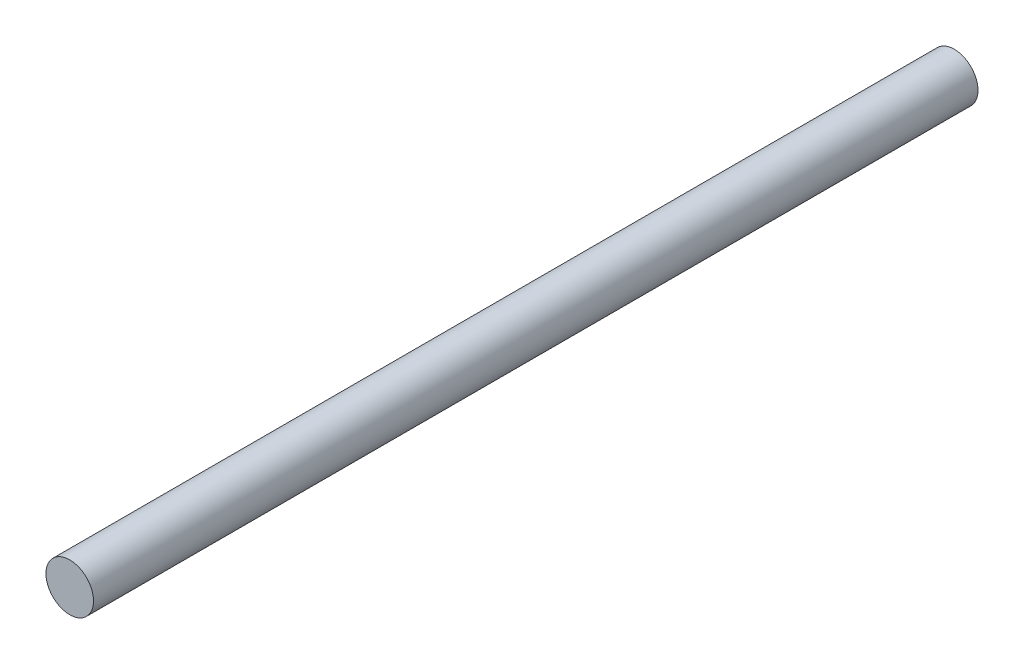
ISO-10303-21;
HEADER;
FILE_DESCRIPTION(('STEP AP214'),'2;1');
FILE_NAME('part.step','',(''),(''),'','','');
FILE_SCHEMA(('AUTOMOTIVE_DESIGN { 1 0 10303 214 1 1 1 1 }'));
ENDSEC;
DATA;
#1=APPLICATION_CONTEXT('core data for automotive mechanical design processes');
#2=APPLICATION_PROTOCOL_DEFINITION('international standard','automotive_design',2000,#1);
#3=PRODUCT_CONTEXT('',#1,'mechanical');
#4=PRODUCT('Part','Part','',(#3));
#5=PRODUCT_RELATED_PRODUCT_CATEGORY('part','',(#4));
#6=PRODUCT_DEFINITION_FORMATION('','',#4);
#7=PRODUCT_DEFINITION_CONTEXT('part definition',#1,'design');
#8=PRODUCT_DEFINITION('design','',#6,#7);
#9=PRODUCT_DEFINITION_SHAPE('','',#8);
#10=(LENGTH_UNIT() NAMED_UNIT(*) SI_UNIT(.MILLI.,.METRE.));
#11=(NAMED_UNIT(*) PLANE_ANGLE_UNIT() SI_UNIT($,.RADIAN.));
#12=(NAMED_UNIT(*) SI_UNIT($,.STERADIAN.) SOLID_ANGLE_UNIT());
#13=UNCERTAINTY_MEASURE_WITH_UNIT(LENGTH_MEASURE(1.E-05),#10,'distance_accuracy_value','');
#14=(GEOMETRIC_REPRESENTATION_CONTEXT(3) GLOBAL_UNCERTAINTY_ASSIGNED_CONTEXT((#13)) GLOBAL_UNIT_ASSIGNED_CONTEXT((#10,
#11,#12)) REPRESENTATION_CONTEXT('',''));
#15=CARTESIAN_POINT('',(0.,0.,0.));
#16=DIRECTION('',(0.,0.,1.));
#17=DIRECTION('',(1.,0.,0.));
#18=AXIS2_PLACEMENT_3D('',#15,#16,#17);
#19=CARTESIAN_POINT('',(0.,0.,236.22));
#20=DIRECTION('',(0.,0.,-1.));
#21=DIRECTION('',(-1.,0.,0.));
#22=AXIS2_PLACEMENT_3D('',#19,#20,#21);
#23=CYLINDRICAL_SURFACE('',#22,6.35);
#24=CARTESIAN_POINT('',(0.,0.,236.22));
#25=DIRECTION('',(0.,0.,1.));
#26=DIRECTION('',(1.,0.,0.));
#27=AXIS2_PLACEMENT_3D('',#24,#25,#26);
#28=CIRCLE('',#27,6.35);
#29=CARTESIAN_POINT('',(6.35,0.,236.22));
#30=VERTEX_POINT('',#29);
#31=EDGE_CURVE('E10',#30,#30,#28,.T.);
#32=ORIENTED_EDGE('',*,*,#31,.F.);
#33=EDGE_LOOP('',(#32));
#34=FACE_BOUND('',#33,.T.);
#35=CARTESIAN_POINT('',(0.,0.,0.));
#36=DIRECTION('',(0.,0.,1.));
#37=DIRECTION('',(1.,0.,0.));
#38=AXIS2_PLACEMENT_3D('',#35,#36,#37);
#39=CIRCLE('',#38,6.35);
#40=CARTESIAN_POINT('',(6.35,0.,0.));
#41=VERTEX_POINT('',#40);
#42=EDGE_CURVE('E42',#41,#41,#39,.T.);
#43=ORIENTED_EDGE('',*,*,#42,.T.);
#44=EDGE_LOOP('',(#43));
#45=FACE_BOUND('',#44,.T.);
#46=ADVANCED_FACE('F39',(#34,#45),#23,.T.);
#47=CARTESIAN_POINT('',(0.,0.,236.22));
#48=DIRECTION('',(0.,0.,1.));
#49=DIRECTION('',(1.,0.,0.));
#50=AXIS2_PLACEMENT_3D('',#47,#48,#49);
#51=PLANE('',#50);
#52=ORIENTED_EDGE('',*,*,#31,.T.);
#53=EDGE_LOOP('',(#52));
#54=FACE_BOUND('',#53,.T.);
#55=ADVANCED_FACE('F56',(#54),#51,.T.);
#56=CARTESIAN_POINT('',(0.,0.,0.));
#57=DIRECTION('',(0.,0.,1.));
#58=DIRECTION('',(1.,0.,0.));
#59=AXIS2_PLACEMENT_3D('',#56,#57,#58);
#60=PLANE('',#59);
#61=ORIENTED_EDGE('',*,*,#42,.F.);
#62=EDGE_LOOP('',(#61));
#63=FACE_BOUND('',#62,.T.);
#64=ADVANCED_FACE('F54',(#63),#60,.F.);
#65=CLOSED_SHELL('',(#46,#55,#64));
#66=MANIFOLD_SOLID_BREP('B2',#65);
#67=ADVANCED_BREP_SHAPE_REPRESENTATION('',(#18,#66),#14);
#68=SHAPE_DEFINITION_REPRESENTATION(#9,#67);
ENDSEC;
END-ISO-10303-21;
